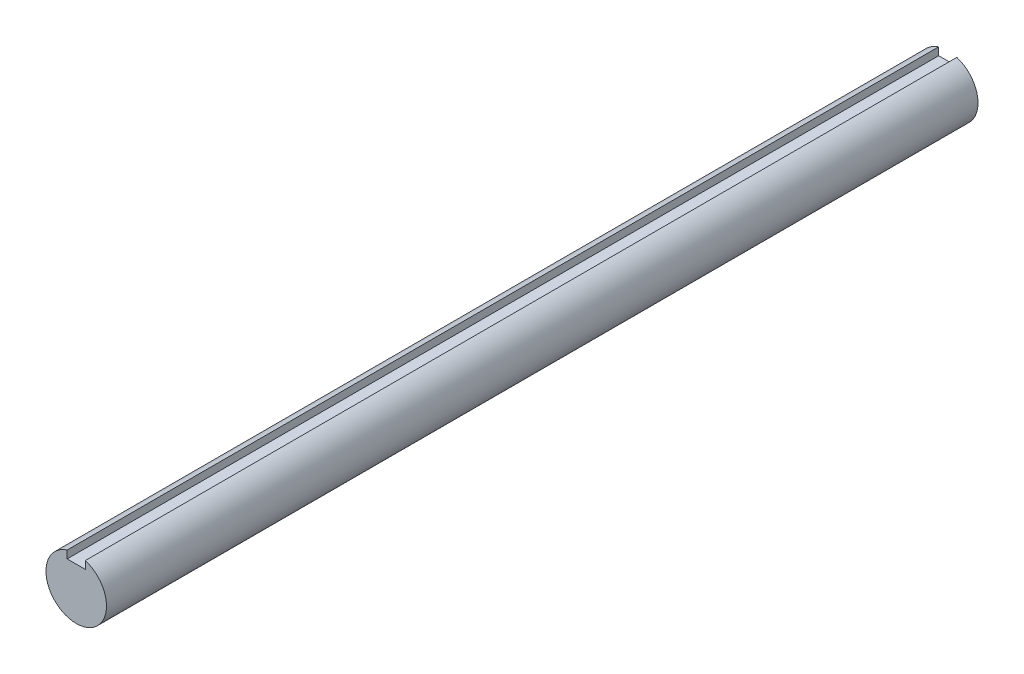
ISO-10303-21;
HEADER;
FILE_DESCRIPTION(('STEP AP214'),'2;1');
FILE_NAME('part.step','',(''),(''),'','','');
FILE_SCHEMA(('AUTOMOTIVE_DESIGN { 1 0 10303 214 1 1 1 1 }'));
ENDSEC;
DATA;
#1=APPLICATION_CONTEXT('core data for automotive mechanical design processes');
#2=APPLICATION_PROTOCOL_DEFINITION('international standard','automotive_design',2000,#1);
#3=PRODUCT_CONTEXT('',#1,'mechanical');
#4=PRODUCT('Part','Part','',(#3));
#5=PRODUCT_RELATED_PRODUCT_CATEGORY('part','',(#4));
#6=PRODUCT_DEFINITION_FORMATION('','',#4);
#7=PRODUCT_DEFINITION_CONTEXT('part definition',#1,'design');
#8=PRODUCT_DEFINITION('design','',#6,#7);
#9=PRODUCT_DEFINITION_SHAPE('','',#8);
#10=(LENGTH_UNIT() NAMED_UNIT(*) SI_UNIT(.MILLI.,.METRE.));
#11=(NAMED_UNIT(*) PLANE_ANGLE_UNIT() SI_UNIT($,.RADIAN.));
#12=(NAMED_UNIT(*) SI_UNIT($,.STERADIAN.) SOLID_ANGLE_UNIT());
#13=UNCERTAINTY_MEASURE_WITH_UNIT(LENGTH_MEASURE(1.E-05),#10,'distance_accuracy_value','');
#14=(GEOMETRIC_REPRESENTATION_CONTEXT(3) GLOBAL_UNCERTAINTY_ASSIGNED_CONTEXT((#13)) GLOBAL_UNIT_ASSIGNED_CONTEXT((#10,
#11,#12)) REPRESENTATION_CONTEXT('',''));
#15=CARTESIAN_POINT('',(0.,0.,0.));
#16=DIRECTION('',(0.,0.,1.));
#17=DIRECTION('',(1.,0.,0.));
#18=AXIS2_PLACEMENT_3D('',#15,#16,#17);
#19=CARTESIAN_POINT('',(0.,0.,57.15));
#20=DIRECTION('',(0.,0.,-1.));
#21=DIRECTION('',(-1.,0.,0.));
#22=AXIS2_PLACEMENT_3D('',#19,#20,#21);
#23=CYLINDRICAL_SURFACE('',#22,3.96874999999999);
#24=DIRECTION('',(0.,0.,-1.));
#25=VECTOR('',#24,1.);
#26=CARTESIAN_POINT('',(-1.1938,3.78494625093936,57.15));
#27=LINE('',#26,#25);
#28=CARTESIAN_POINT('',(-1.1938,3.78494625093936,57.15));
#29=VERTEX_POINT('',#28);
#30=CARTESIAN_POINT('',(-1.1938,3.78494625093936,-57.15));
#31=VERTEX_POINT('',#30);
#32=EDGE_CURVE('E104',#29,#31,#27,.T.);
#33=ORIENTED_EDGE('',*,*,#32,.T.);
#34=CARTESIAN_POINT('',(0.,0.,-57.15));
#35=DIRECTION('',(0.,0.,1.));
#36=DIRECTION('',(1.,0.,0.));
#37=AXIS2_PLACEMENT_3D('',#34,#35,#36);
#38=CIRCLE('',#37,3.96874999999999);
#39=CARTESIAN_POINT('',(1.1938,3.78494625093936,-57.15));
#40=VERTEX_POINT('',#39);
#41=EDGE_CURVE('E98',#31,#40,#38,.T.);
#42=ORIENTED_EDGE('',*,*,#41,.T.);
#43=DIRECTION('',(0.,0.,-1.));
#44=VECTOR('',#43,1.);
#45=CARTESIAN_POINT('',(1.1938,3.78494625093936,57.15));
#46=LINE('',#45,#44);
#47=CARTESIAN_POINT('',(1.1938,3.78494625093936,57.15));
#48=VERTEX_POINT('',#47);
#49=EDGE_CURVE('E11',#48,#40,#46,.T.);
#50=ORIENTED_EDGE('',*,*,#49,.F.);
#51=CARTESIAN_POINT('',(0.,0.,57.15));
#52=DIRECTION('',(0.,0.,1.));
#53=DIRECTION('',(1.,0.,0.));
#54=AXIS2_PLACEMENT_3D('',#51,#52,#53);
#55=CIRCLE('',#54,3.96874999999999);
#56=EDGE_CURVE('E113',#29,#48,#55,.T.);
#57=ORIENTED_EDGE('',*,*,#56,.F.);
#58=EDGE_LOOP('',(#33,#42,#50,#57));
#59=FACE_BOUND('',#58,.T.);
#60=ADVANCED_FACE('F45',(#59),#23,.T.);
#61=CARTESIAN_POINT('',(1.1938,2.77494999999999,57.15));
#62=DIRECTION('',(1.,0.,0.));
#63=DIRECTION('',(0.,0.,-1.));
#64=AXIS2_PLACEMENT_3D('',#61,#62,#63);
#65=PLANE('',#64);
#66=ORIENTED_EDGE('',*,*,#49,.T.);
#67=DIRECTION('',(0.,-1.,0.));
#68=VECTOR('',#67,1.);
#69=CARTESIAN_POINT('',(1.1938,2.77494999999999,-57.15));
#70=LINE('',#69,#68);
#71=CARTESIAN_POINT('',(1.1938,2.77494999999999,-57.15));
#72=VERTEX_POINT('',#71);
#73=EDGE_CURVE('E88',#40,#72,#70,.T.);
#74=ORIENTED_EDGE('',*,*,#73,.T.);
#75=DIRECTION('',(0.,0.,-1.));
#76=VECTOR('',#75,1.);
#77=CARTESIAN_POINT('',(1.1938,2.77494999999999,57.15));
#78=LINE('',#77,#76);
#79=CARTESIAN_POINT('',(1.1938,2.77494999999999,57.15));
#80=VERTEX_POINT('',#79);
#81=EDGE_CURVE('E53',#80,#72,#78,.T.);
#82=ORIENTED_EDGE('',*,*,#81,.F.);
#83=DIRECTION('',(0.,-1.,0.));
#84=VECTOR('',#83,1.);
#85=CARTESIAN_POINT('',(1.1938,2.77494999999999,57.15));
#86=LINE('',#85,#84);
#87=EDGE_CURVE('E89',#48,#80,#86,.T.);
#88=ORIENTED_EDGE('',*,*,#87,.F.);
#89=EDGE_LOOP('',(#66,#74,#82,#88));
#90=FACE_BOUND('',#89,.T.);
#91=ADVANCED_FACE('F86',(#90),#65,.F.);
#92=CARTESIAN_POINT('',(1.1938,2.77494999999999,57.15));
#93=DIRECTION('',(0.,-1.,0.));
#94=DIRECTION('',(0.,0.,-1.));
#95=AXIS2_PLACEMENT_3D('',#92,#93,#94);
#96=PLANE('',#95);
#97=ORIENTED_EDGE('',*,*,#81,.T.);
#98=DIRECTION('',(-1.,0.,0.));
#99=VECTOR('',#98,1.);
#100=CARTESIAN_POINT('',(1.1938,2.77494999999999,-57.15));
#101=LINE('',#100,#99);
#102=CARTESIAN_POINT('',(-1.1938,2.77494999999999,-57.15));
#103=VERTEX_POINT('',#102);
#104=EDGE_CURVE('E101',#72,#103,#101,.T.);
#105=ORIENTED_EDGE('',*,*,#104,.T.);
#106=DIRECTION('',(0.,0.,-1.));
#107=VECTOR('',#106,1.);
#108=CARTESIAN_POINT('',(-1.1938,2.77494999999999,57.15));
#109=LINE('',#108,#107);
#110=CARTESIAN_POINT('',(-1.1938,2.77494999999999,57.15));
#111=VERTEX_POINT('',#110);
#112=EDGE_CURVE('E124',#111,#103,#109,.T.);
#113=ORIENTED_EDGE('',*,*,#112,.F.);
#114=DIRECTION('',(-1.,0.,0.));
#115=VECTOR('',#114,1.);
#116=CARTESIAN_POINT('',(1.1938,2.77494999999999,57.15));
#117=LINE('',#116,#115);
#118=EDGE_CURVE('E65',#80,#111,#117,.T.);
#119=ORIENTED_EDGE('',*,*,#118,.F.);
#120=EDGE_LOOP('',(#97,#105,#113,#119));
#121=FACE_BOUND('',#120,.T.);
#122=ADVANCED_FACE('F128',(#121),#96,.F.);
#123=CARTESIAN_POINT('',(-1.1938,2.77494999999999,57.15));
#124=DIRECTION('',(-1.,0.,0.));
#125=DIRECTION('',(0.,0.,1.));
#126=AXIS2_PLACEMENT_3D('',#123,#124,#125);
#127=PLANE('',#126);
#128=ORIENTED_EDGE('',*,*,#112,.T.);
#129=DIRECTION('',(0.,1.,0.));
#130=VECTOR('',#129,1.);
#131=CARTESIAN_POINT('',(-1.1938,2.77494999999999,-57.15));
#132=LINE('',#131,#130);
#133=EDGE_CURVE('E110',#103,#31,#132,.T.);
#134=ORIENTED_EDGE('',*,*,#133,.T.);
#135=ORIENTED_EDGE('',*,*,#32,.F.);
#136=DIRECTION('',(0.,1.,0.));
#137=VECTOR('',#136,1.);
#138=CARTESIAN_POINT('',(-1.1938,2.77494999999999,57.15));
#139=LINE('',#138,#137);
#140=EDGE_CURVE('E60',#111,#29,#139,.T.);
#141=ORIENTED_EDGE('',*,*,#140,.F.);
#142=EDGE_LOOP('',(#128,#134,#135,#141));
#143=FACE_BOUND('',#142,.T.);
#144=ADVANCED_FACE('F130',(#143),#127,.F.);
#145=CARTESIAN_POINT('',(0.,0.,57.15));
#146=DIRECTION('',(0.,0.,1.));
#147=DIRECTION('',(1.,0.,0.));
#148=AXIS2_PLACEMENT_3D('',#145,#146,#147);
#149=PLANE('',#148);
#150=ORIENTED_EDGE('',*,*,#56,.T.);
#151=ORIENTED_EDGE('',*,*,#87,.T.);
#152=ORIENTED_EDGE('',*,*,#118,.T.);
#153=ORIENTED_EDGE('',*,*,#140,.T.);
#154=EDGE_LOOP('',(#150,#151,#152,#153));
#155=FACE_BOUND('',#154,.T.);
#156=ADVANCED_FACE('F131',(#155),#149,.T.);
#157=CARTESIAN_POINT('',(0.,0.,-57.15));
#158=DIRECTION('',(0.,0.,1.));
#159=DIRECTION('',(1.,0.,0.));
#160=AXIS2_PLACEMENT_3D('',#157,#158,#159);
#161=PLANE('',#160);
#162=ORIENTED_EDGE('',*,*,#41,.F.);
#163=ORIENTED_EDGE('',*,*,#133,.F.);
#164=ORIENTED_EDGE('',*,*,#104,.F.);
#165=ORIENTED_EDGE('',*,*,#73,.F.);
#166=EDGE_LOOP('',(#162,#163,#164,#165));
#167=FACE_BOUND('',#166,.T.);
#168=ADVANCED_FACE('F96',(#167),#161,.F.);
#169=CLOSED_SHELL('',(#60,#91,#122,#144,#156,#168));
#170=MANIFOLD_SOLID_BREP('B2',#169);
#171=ADVANCED_BREP_SHAPE_REPRESENTATION('',(#18,#170),#14);
#172=SHAPE_DEFINITION_REPRESENTATION(#9,#171);
ENDSEC;
END-ISO-10303-21;
